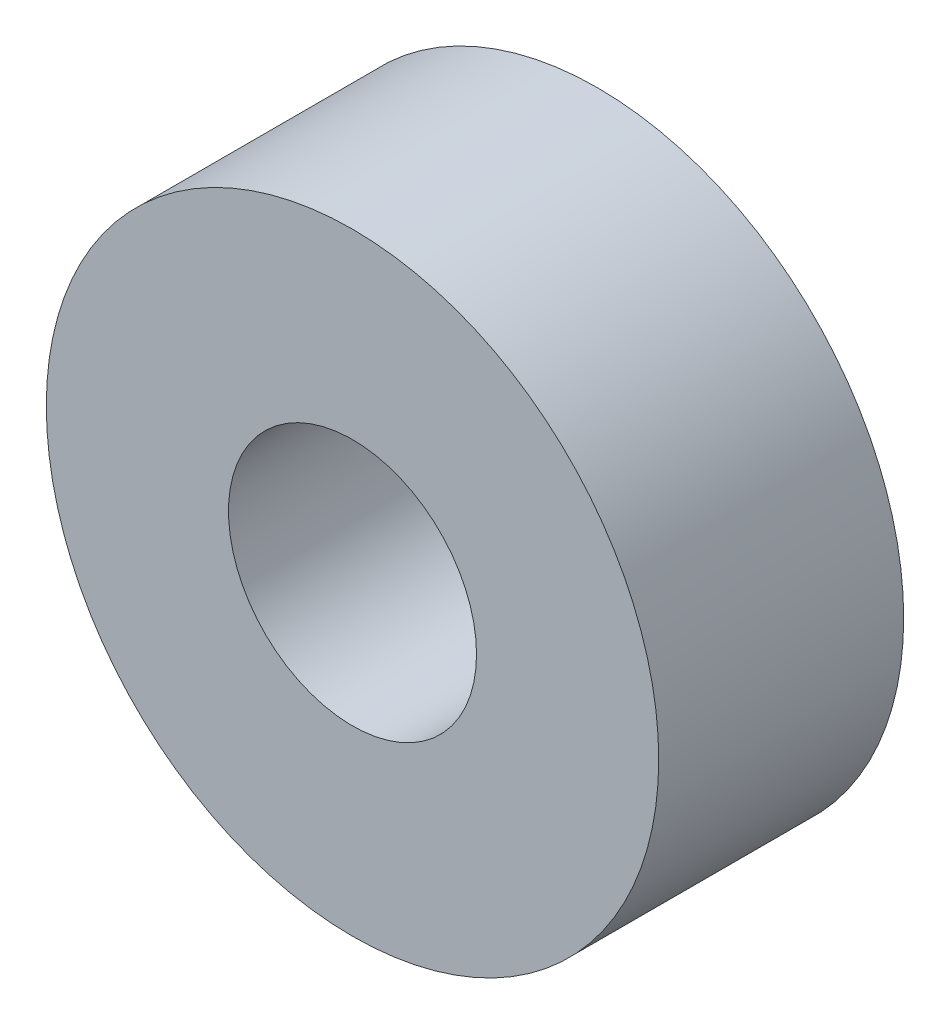
ISO-10303-21;
HEADER;
FILE_DESCRIPTION(('STEP AP214'),'2;1');
FILE_NAME('part.step','',(''),(''),'','','');
FILE_SCHEMA(('AUTOMOTIVE_DESIGN { 1 0 10303 214 1 1 1 1 }'));
ENDSEC;
DATA;
#1=APPLICATION_CONTEXT('core data for automotive mechanical design processes');
#2=APPLICATION_PROTOCOL_DEFINITION('international standard','automotive_design',2000,#1);
#3=PRODUCT_CONTEXT('',#1,'mechanical');
#4=PRODUCT('Part','Part','',(#3));
#5=PRODUCT_RELATED_PRODUCT_CATEGORY('part','',(#4));
#6=PRODUCT_DEFINITION_FORMATION('','',#4);
#7=PRODUCT_DEFINITION_CONTEXT('part definition',#1,'design');
#8=PRODUCT_DEFINITION('design','',#6,#7);
#9=PRODUCT_DEFINITION_SHAPE('','',#8);
#10=(LENGTH_UNIT() NAMED_UNIT(*) SI_UNIT(.MILLI.,.METRE.));
#11=(NAMED_UNIT(*) PLANE_ANGLE_UNIT() SI_UNIT($,.RADIAN.));
#12=(NAMED_UNIT(*) SI_UNIT($,.STERADIAN.) SOLID_ANGLE_UNIT());
#13=UNCERTAINTY_MEASURE_WITH_UNIT(LENGTH_MEASURE(1.E-05),#10,'distance_accuracy_value','');
#14=(GEOMETRIC_REPRESENTATION_CONTEXT(3) GLOBAL_UNCERTAINTY_ASSIGNED_CONTEXT((#13)) GLOBAL_UNIT_ASSIGNED_CONTEXT((#10,
#11,#12)) REPRESENTATION_CONTEXT('',''));
#15=CARTESIAN_POINT('',(0.,0.,0.));
#16=DIRECTION('',(0.,0.,1.));
#17=DIRECTION('',(1.,0.,0.));
#18=AXIS2_PLACEMENT_3D('',#15,#16,#17);
#19=CARTESIAN_POINT('',(0.,0.,8.));
#20=DIRECTION('',(0.,0.,1.));
#21=DIRECTION('',(1.,0.,0.));
#22=AXIS2_PLACEMENT_3D('',#19,#20,#21);
#23=PLANE('',#22);
#24=CARTESIAN_POINT('',(0.,0.,8.));
#25=DIRECTION('',(0.,0.,1.));
#26=DIRECTION('',(1.,0.,0.));
#27=AXIS2_PLACEMENT_3D('',#24,#25,#26);
#28=CIRCLE('',#27,10.);
#29=CARTESIAN_POINT('',(10.,0.,8.));
#30=VERTEX_POINT('',#29);
#31=EDGE_CURVE('E10',#30,#30,#28,.T.);
#32=ORIENTED_EDGE('',*,*,#31,.T.);
#33=EDGE_LOOP('',(#32));
#34=FACE_BOUND('',#33,.T.);
#35=CARTESIAN_POINT('',(0.,0.,8.));
#36=DIRECTION('',(0.,0.,1.));
#37=DIRECTION('',(1.,0.,0.));
#38=AXIS2_PLACEMENT_3D('',#35,#36,#37);
#39=CIRCLE('',#38,4.05);
#40=CARTESIAN_POINT('',(4.05,0.,8.));
#41=VERTEX_POINT('',#40);
#42=EDGE_CURVE('E56',#41,#41,#39,.T.);
#43=ORIENTED_EDGE('',*,*,#42,.F.);
#44=EDGE_LOOP('',(#43));
#45=FACE_BOUND('',#44,.T.);
#46=ADVANCED_FACE('F43',(#34,#45),#23,.T.);
#47=CARTESIAN_POINT('',(0.,0.,0.));
#48=DIRECTION('',(0.,0.,1.));
#49=DIRECTION('',(1.,0.,0.));
#50=AXIS2_PLACEMENT_3D('',#47,#48,#49);
#51=PLANE('',#50);
#52=CARTESIAN_POINT('',(0.,0.,0.));
#53=DIRECTION('',(0.,0.,1.));
#54=DIRECTION('',(1.,0.,0.));
#55=AXIS2_PLACEMENT_3D('',#52,#53,#54);
#56=CIRCLE('',#55,10.);
#57=CARTESIAN_POINT('',(10.,0.,0.));
#58=VERTEX_POINT('',#57);
#59=EDGE_CURVE('E47',#58,#58,#56,.T.);
#60=ORIENTED_EDGE('',*,*,#59,.F.);
#61=EDGE_LOOP('',(#60));
#62=FACE_BOUND('',#61,.T.);
#63=CARTESIAN_POINT('',(0.,0.,0.));
#64=DIRECTION('',(0.,0.,1.));
#65=DIRECTION('',(1.,0.,0.));
#66=AXIS2_PLACEMENT_3D('',#63,#64,#65);
#67=CIRCLE('',#66,4.05);
#68=CARTESIAN_POINT('',(4.05,0.,0.));
#69=VERTEX_POINT('',#68);
#70=EDGE_CURVE('E58',#69,#69,#67,.T.);
#71=ORIENTED_EDGE('',*,*,#70,.T.);
#72=EDGE_LOOP('',(#71));
#73=FACE_BOUND('',#72,.T.);
#74=ADVANCED_FACE('F70',(#62,#73),#51,.F.);
#75=CARTESIAN_POINT('',(0.,0.,8.));
#76=DIRECTION('',(0.,0.,-1.));
#77=DIRECTION('',(-1.,0.,0.));
#78=AXIS2_PLACEMENT_3D('',#75,#76,#77);
#79=CYLINDRICAL_SURFACE('',#78,10.);
#80=ORIENTED_EDGE('',*,*,#31,.F.);
#81=EDGE_LOOP('',(#80));
#82=FACE_BOUND('',#81,.T.);
#83=ORIENTED_EDGE('',*,*,#59,.T.);
#84=EDGE_LOOP('',(#83));
#85=FACE_BOUND('',#84,.T.);
#86=ADVANCED_FACE('F45',(#82,#85),#79,.T.);
#87=CARTESIAN_POINT('',(0.,0.,8.));
#88=DIRECTION('',(0.,0.,-1.));
#89=DIRECTION('',(-1.,0.,0.));
#90=AXIS2_PLACEMENT_3D('',#87,#88,#89);
#91=CYLINDRICAL_SURFACE('',#90,4.05);
#92=ORIENTED_EDGE('',*,*,#42,.T.);
#93=EDGE_LOOP('',(#92));
#94=FACE_BOUND('',#93,.T.);
#95=ORIENTED_EDGE('',*,*,#70,.F.);
#96=EDGE_LOOP('',(#95));
#97=FACE_BOUND('',#96,.T.);
#98=ADVANCED_FACE('F66',(#94,#97),#91,.F.);
#99=CLOSED_SHELL('',(#46,#74,#86,#98));
#100=MANIFOLD_SOLID_BREP('B2',#99);
#101=ADVANCED_BREP_SHAPE_REPRESENTATION('',(#18,#100),#14);
#102=SHAPE_DEFINITION_REPRESENTATION(#9,#101);
ENDSEC;
END-ISO-10303-21;
